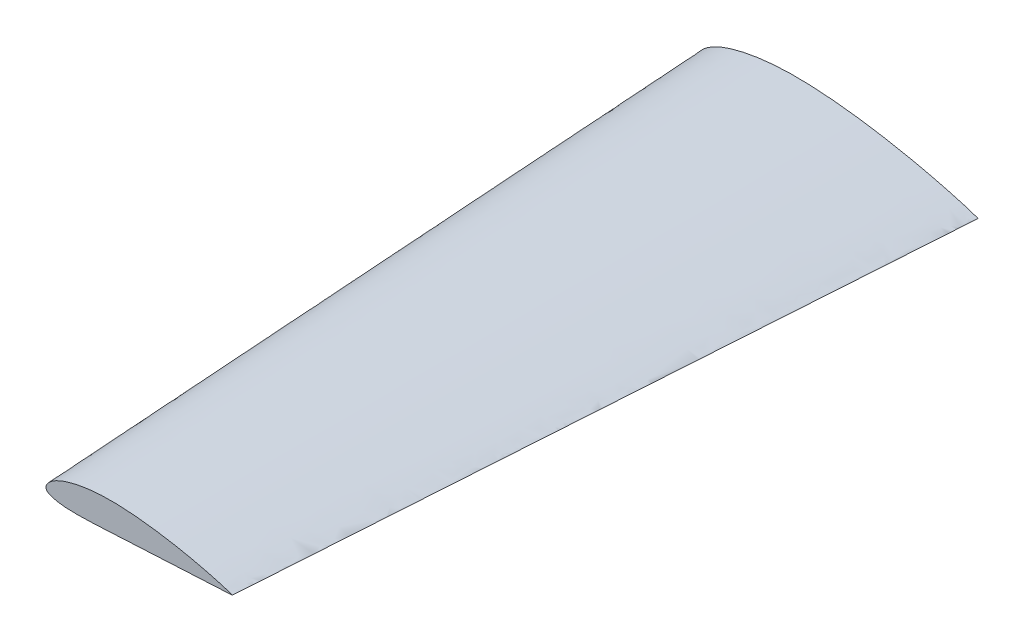
ISO-10303-21;
HEADER;
FILE_DESCRIPTION(('STEP AP214'),'2;1');
FILE_NAME('part.step','',(''),(''),'','','');
FILE_SCHEMA(('AUTOMOTIVE_DESIGN { 1 0 10303 214 1 1 1 1 }'));
ENDSEC;
DATA;
#1=APPLICATION_CONTEXT('core data for automotive mechanical design processes');
#2=APPLICATION_PROTOCOL_DEFINITION('international standard','automotive_design',2000,#1);
#3=PRODUCT_CONTEXT('',#1,'mechanical');
#4=PRODUCT('Part','Part','',(#3));
#5=PRODUCT_RELATED_PRODUCT_CATEGORY('part','',(#4));
#6=PRODUCT_DEFINITION_FORMATION('','',#4);
#7=PRODUCT_DEFINITION_CONTEXT('part definition',#1,'design');
#8=PRODUCT_DEFINITION('design','',#6,#7);
#9=PRODUCT_DEFINITION_SHAPE('','',#8);
#10=(LENGTH_UNIT() NAMED_UNIT(*) SI_UNIT(.MILLI.,.METRE.));
#11=(NAMED_UNIT(*) PLANE_ANGLE_UNIT() SI_UNIT($,.RADIAN.));
#12=(NAMED_UNIT(*) SI_UNIT($,.STERADIAN.) SOLID_ANGLE_UNIT());
#13=UNCERTAINTY_MEASURE_WITH_UNIT(LENGTH_MEASURE(1.E-05),#10,'distance_accuracy_value','');
#14=(GEOMETRIC_REPRESENTATION_CONTEXT(3) GLOBAL_UNCERTAINTY_ASSIGNED_CONTEXT((#13)) GLOBAL_UNIT_ASSIGNED_CONTEXT((#10,
#11,#12)) REPRESENTATION_CONTEXT('',''));
#15=CARTESIAN_POINT('',(0.,0.,0.));
#16=DIRECTION('',(0.,0.,1.));
#17=DIRECTION('',(1.,0.,0.));
#18=AXIS2_PLACEMENT_3D('',#15,#16,#17);
#19=CARTESIAN_POINT('',(20.3542982458675,1.34514342964588,300.));
#20=DIRECTION('',(0.,0.,-1.));
#21=DIRECTION('',(-1.,0.,0.));
#22=AXIS2_PLACEMENT_3D('',#19,#20,#21);
#23=PLANE('',#22);
#24=CARTESIAN_POINT('',(100.,0.,300.));
#25=CARTESIAN_POINT('',(100.014923169262,0.0592388089626518,300.));
#26=CARTESIAN_POINT('',(98.3529769440514,0.511038186945055,300.));
#27=CARTESIAN_POINT('',(97.0969794574008,1.03966162187566,300.));
#28=CARTESIAN_POINT('',(94.4018178812771,1.80139976342404,300.));
#29=CARTESIAN_POINT('',(91.5774953760021,2.59080174867619,300.));
#30=CARTESIAN_POINT('',(88.1259798370144,3.47753080508084,300.));
#31=CARTESIAN_POINT('',(84.2217100096211,4.40446850526963,300.));
#32=CARTESIAN_POINT('',(79.8953408602356,5.35215076036016,300.));
#33=CARTESIAN_POINT('',(75.2308646597816,6.2701026833677,300.));
#34=CARTESIAN_POINT('',(70.3041328387238,7.11696708440821,300.));
#35=CARTESIAN_POINT('',(65.2008228846164,7.85540207923427,300.));
#36=CARTESIAN_POINT('',(60.0084258675896,8.45749052318448,300.));
#37=CARTESIAN_POINT('',(54.8154414029379,8.89296179445461,300.));
#38=CARTESIAN_POINT('',(49.7087787786779,9.11718139088869,300.));
#39=CARTESIAN_POINT('',(44.7749515151268,9.08549151114679,300.));
#40=CARTESIAN_POINT('',(40.1001215647839,8.78047675865518,300.));
#41=CARTESIAN_POINT('',(35.7650377112056,8.22003855734951,300.));
#42=CARTESIAN_POINT('',(31.8431393592005,7.43515761318965,300.));
#43=CARTESIAN_POINT('',(28.3975621307644,6.47381434625063,300.));
#44=CARTESIAN_POINT('',(25.4743709849585,5.36057571079238,300.));
#45=CARTESIAN_POINT('',(23.1643125092464,4.08874700360212,300.));
#46=CARTESIAN_POINT('',(21.4182453437574,2.80505456301613,300.));
#47=CARTESIAN_POINT('',(20.3342940907016,1.4857636098498,300.));
#48=CARTESIAN_POINT('',(19.848876137766,0.16094790784733,300.));
#49=CARTESIAN_POINT('',(20.5607003857686,-1.62078308380909,300.));
#50=CARTESIAN_POINT('',(23.3461486495499,-2.47062334575145,300.));
#51=CARTESIAN_POINT('',(27.0944757373181,-3.21353066773721,300.));
#52=CARTESIAN_POINT('',(32.0919146293912,-3.38211658366619,300.));
#53=CARTESIAN_POINT('',(38.0597809883925,-3.29061362877646,300.));
#54=CARTESIAN_POINT('',(44.8910379391885,-2.95007097060458,300.));
#55=CARTESIAN_POINT('',(52.2961856480144,-2.58123272556939,300.));
#56=CARTESIAN_POINT('',(60.0015784426429,-2.17844007735752,300.));
#57=CARTESIAN_POINT('',(67.7029961352897,-1.72772962023577,300.));
#58=CARTESIAN_POINT('',(75.1137779773506,-1.27940221867296,300.));
#59=CARTESIAN_POINT('',(81.9255850266116,-0.915018444337756,300.));
#60=CARTESIAN_POINT('',(87.9561922617108,-0.63965732422303,300.));
#61=CARTESIAN_POINT('',(92.7389461096696,-0.400523517451224,300.));
#62=CARTESIAN_POINT('',(96.6958495882715,-0.306482613810462,300.));
#63=CARTESIAN_POINT('',(98.3883941773635,-0.0811743747246907,300.));
#64=CARTESIAN_POINT('',(99.9859090432853,-0.0559352693961097,300.));
#65=CARTESIAN_POINT('',(100.,0.,300.));
#66=B_SPLINE_CURVE_WITH_KNOTS('',3,(#24,#25,#26,#27,#28,#29,#30,#31,#32,#33,#34,#35,#36,#37,#38,
#39,#40,#41,#42,#43,#44,#45,#46,#47,#48,#49,#50,#51,#52,#53,#54,#55,#56,#57,#58,#59,#60,#61,#62,
#63,#64,#65),.UNSPECIFIED.,.T.,.F.,(4,1,1,1,1,1,1,1,1,1,1,1,1,1,1,1,1,1,1,1,1,1,1,1,1,1,1,1,1,1,
1,1,1,1,1,1,1,1,1,4),(0.,0.00495576371400358,0.0195005280764471,0.0341339283486635,
0.0524049542143257,0.0739943309224443,0.0984931531585991,0.125474601337429,0.154451971064024,
0.184909300231469,0.216326676925909,0.248168985989691,0.279908729565615,0.311030457196045,
0.341049811862573,0.369546227571225,0.396130574732561,0.420447044709539,0.442179640217013,
0.461102572305862,0.477136471921637,0.490041484410884,0.500147947583578,0.508077763123304,
0.514148335024584,0.53273119249296,0.555552546441872,0.58573949839938,0.622463906786317,
0.664407467873401,0.709926080574513,0.757276032828189,0.804638844685232,0.850179122578555,
0.892141924950279,0.928905522286394,0.959074072533095,0.981494735532468,0.995320601759886,1.),.UNSPECIFIED.);
#67=CARTESIAN_POINT('',(100.,0.,300.));
#68=VERTEX_POINT('',#67);
#69=EDGE_CURVE('E11',#68,#68,#66,.T.);
#70=ORIENTED_EDGE('',*,*,#69,.T.);
#71=EDGE_LOOP('',(#70));
#72=FACE_BOUND('',#71,.T.);
#73=ADVANCED_FACE('F49',(#72),#23,.F.);
#74=CARTESIAN_POINT('',(0.53144736880117,2.01771514446881,0.));
#75=DIRECTION('',(0.,0.,-1.));
#76=DIRECTION('',(-1.,0.,0.));
#77=AXIS2_PLACEMENT_3D('',#74,#75,#76);
#78=PLANE('',#77);
#79=CARTESIAN_POINT('',(120.,0.,0.));
#80=CARTESIAN_POINT('',(120.022384753893,0.0888582134439777,0.));
#81=CARTESIAN_POINT('',(117.529465416077,0.766557280417583,0.));
#82=CARTESIAN_POINT('',(115.645469186101,1.5594924328135,0.));
#83=CARTESIAN_POINT('',(111.602726821916,2.70209964513606,0.));
#84=CARTESIAN_POINT('',(107.366243064003,3.88620262301428,0.));
#85=CARTESIAN_POINT('',(102.188969755522,5.21629620762126,0.));
#86=CARTESIAN_POINT('',(96.3325650144317,6.60670275790445,0.));
#87=CARTESIAN_POINT('',(89.8430112903535,8.02822614054024,0.));
#88=CARTESIAN_POINT('',(82.8462969896723,9.40515402505156,0.));
#89=CARTESIAN_POINT('',(75.4561992580857,10.6754506266123,0.));
#90=CARTESIAN_POINT('',(67.8012343269246,11.7831031188514,0.));
#91=CARTESIAN_POINT('',(60.0126388013843,12.6862357847767,0.));
#92=CARTESIAN_POINT('',(52.2231621044069,13.3394426916819,0.));
#93=CARTESIAN_POINT('',(44.5631681680168,13.675772086333,0.));
#94=CARTESIAN_POINT('',(37.1624272726901,13.6282372667202,0.));
#95=CARTESIAN_POINT('',(30.1501823471758,13.1707151379828,0.));
#96=CARTESIAN_POINT('',(23.6475565668083,12.3300578360243,0.));
#97=CARTESIAN_POINT('',(17.7647090388008,11.1527364197845,0.));
#98=CARTESIAN_POINT('',(12.5963431961465,9.71072151937595,0.));
#99=CARTESIAN_POINT('',(8.21155647743776,8.04086356618857,0.));
#100=CARTESIAN_POINT('',(4.74646876386956,6.13312050540317,0.));
#101=CARTESIAN_POINT('',(2.12736801563615,4.2075818445242,0.));
#102=CARTESIAN_POINT('',(0.501441136052392,2.2286454147747,0.));
#103=CARTESIAN_POINT('',(-0.226685793350984,0.241421861770996,0.));
#104=CARTESIAN_POINT('',(0.841050578652947,-2.43117462571363,0.));
#105=CARTESIAN_POINT('',(5.01922297432486,-3.70593501862717,0.));
#106=CARTESIAN_POINT('',(10.6417136059772,-4.82029600160582,0.));
#107=CARTESIAN_POINT('',(18.1378719440869,-5.07317487549928,0.));
#108=CARTESIAN_POINT('',(27.0896714825887,-4.93592044316468,0.));
#109=CARTESIAN_POINT('',(37.3365569087827,-4.42510645590687,0.));
#110=CARTESIAN_POINT('',(48.4442784720216,-3.87184908835409,0.));
#111=CARTESIAN_POINT('',(60.0023676639643,-3.26766011603629,0.));
#112=CARTESIAN_POINT('',(71.5544942029345,-2.59159443035365,0.));
#113=CARTESIAN_POINT('',(82.6706669660259,-1.91910332800944,0.));
#114=CARTESIAN_POINT('',(92.8883775399175,-1.37252766650663,0.));
#115=CARTESIAN_POINT('',(101.934288392566,-0.959485986334544,0.));
#116=CARTESIAN_POINT('',(109.108419164504,-0.600785276176836,0.));
#117=CARTESIAN_POINT('',(115.043774382407,-0.459723920715693,0.));
#118=CARTESIAN_POINT('',(117.582591266045,-0.121761562087036,0.));
#119=CARTESIAN_POINT('',(119.978863564928,-0.0839029040941646,0.));
#120=CARTESIAN_POINT('',(120.,0.,0.));
#121=B_SPLINE_CURVE_WITH_KNOTS('',3,(#79,#80,#81,#82,#83,#84,#85,#86,#87,#88,#89,#90,#91,#92,
#93,#94,#95,#96,#97,#98,#99,#100,#101,#102,#103,#104,#105,#106,#107,#108,#109,#110,#111,#112,
#113,#114,#115,#116,#117,#118,#119,#120),.UNSPECIFIED.,.T.,.F.,(4,1,1,1,1,1,1,1,1,1,1,1,1,1,1,1,
1,1,1,1,1,1,1,1,1,1,1,1,1,1,1,1,1,1,1,1,1,1,1,4),(0.,0.00495576371400358,0.0195005280764471,
0.0341339283486635,0.0524049542143257,0.0739943309224443,0.0984931531585991,0.125474601337429,
0.154451971064024,0.184909300231469,0.216326676925909,0.248168985989691,0.279908729565615,
0.311030457196045,0.341049811862573,0.369546227571225,0.396130574732561,0.420447044709539,
0.442179640217013,0.461102572305862,0.477136471921637,0.490041484410884,0.500147947583578,
0.508077763123304,0.514148335024584,0.53273119249296,0.555552546441872,0.58573949839938,
0.622463906786317,0.664407467873401,0.709926080574513,0.757276032828189,0.804638844685232,
0.850179122578555,0.892141924950279,0.928905522286394,0.959074072533095,0.981494735532468,
0.995320601759886,1.),.UNSPECIFIED.);
#122=CARTESIAN_POINT('',(120.,0.,0.));
#123=VERTEX_POINT('',#122);
#124=EDGE_CURVE('E59',#123,#123,#121,.T.);
#125=ORIENTED_EDGE('',*,*,#124,.F.);
#126=EDGE_LOOP('',(#125));
#127=FACE_BOUND('',#126,.T.);
#128=ADVANCED_FACE('F87',(#127),#78,.T.);
#129=CARTESIAN_POINT('',(120.,0.,0.));
#130=CARTESIAN_POINT('',(100.,0.,300.));
#131=CARTESIAN_POINT('',(120.022384753893,0.0888582134439777,0.));
#132=CARTESIAN_POINT('',(100.014923169262,0.0592388089626518,300.));
#133=CARTESIAN_POINT('',(117.529465416077,0.766557280417583,0.));
#134=CARTESIAN_POINT('',(98.3529769440514,0.511038186945055,300.));
#135=CARTESIAN_POINT('',(115.645469186101,1.5594924328135,0.));
#136=CARTESIAN_POINT('',(97.0969794574008,1.03966162187566,300.));
#137=CARTESIAN_POINT('',(111.602726821916,2.70209964513606,0.));
#138=CARTESIAN_POINT('',(94.4018178812771,1.80139976342404,300.));
#139=CARTESIAN_POINT('',(107.366243064003,3.88620262301428,0.));
#140=CARTESIAN_POINT('',(91.5774953760021,2.59080174867619,300.));
#141=CARTESIAN_POINT('',(102.188969755522,5.21629620762126,0.));
#142=CARTESIAN_POINT('',(88.1259798370144,3.47753080508084,300.));
#143=CARTESIAN_POINT('',(96.3325650144317,6.60670275790445,0.));
#144=CARTESIAN_POINT('',(84.2217100096211,4.40446850526963,300.));
#145=CARTESIAN_POINT('',(89.8430112903535,8.02822614054024,0.));
#146=CARTESIAN_POINT('',(79.8953408602356,5.35215076036016,300.));
#147=CARTESIAN_POINT('',(82.8462969896723,9.40515402505156,0.));
#148=CARTESIAN_POINT('',(75.2308646597816,6.2701026833677,300.));
#149=CARTESIAN_POINT('',(75.4561992580857,10.6754506266123,0.));
#150=CARTESIAN_POINT('',(70.3041328387238,7.11696708440821,300.));
#151=CARTESIAN_POINT('',(67.8012343269246,11.7831031188514,0.));
#152=CARTESIAN_POINT('',(65.2008228846164,7.85540207923427,300.));
#153=CARTESIAN_POINT('',(60.0126388013843,12.6862357847767,0.));
#154=CARTESIAN_POINT('',(60.0084258675896,8.45749052318448,300.));
#155=CARTESIAN_POINT('',(52.2231621044069,13.3394426916819,0.));
#156=CARTESIAN_POINT('',(54.8154414029379,8.89296179445461,300.));
#157=CARTESIAN_POINT('',(44.5631681680168,13.675772086333,0.));
#158=CARTESIAN_POINT('',(49.7087787786779,9.11718139088869,300.));
#159=CARTESIAN_POINT('',(37.1624272726901,13.6282372667202,0.));
#160=CARTESIAN_POINT('',(44.7749515151268,9.08549151114679,300.));
#161=CARTESIAN_POINT('',(30.1501823471758,13.1707151379828,0.));
#162=CARTESIAN_POINT('',(40.1001215647839,8.78047675865518,300.));
#163=CARTESIAN_POINT('',(23.6475565668083,12.3300578360243,0.));
#164=CARTESIAN_POINT('',(35.7650377112056,8.22003855734951,300.));
#165=CARTESIAN_POINT('',(17.7647090388008,11.1527364197845,0.));
#166=CARTESIAN_POINT('',(31.8431393592005,7.43515761318965,300.));
#167=CARTESIAN_POINT('',(12.5963431961465,9.71072151937595,0.));
#168=CARTESIAN_POINT('',(28.3975621307644,6.47381434625063,300.));
#169=CARTESIAN_POINT('',(8.21155647743776,8.04086356618857,0.));
#170=CARTESIAN_POINT('',(25.4743709849585,5.36057571079238,300.));
#171=CARTESIAN_POINT('',(4.74646876386956,6.13312050540317,0.));
#172=CARTESIAN_POINT('',(23.1643125092464,4.08874700360212,300.));
#173=CARTESIAN_POINT('',(2.12736801563615,4.2075818445242,0.));
#174=CARTESIAN_POINT('',(21.4182453437574,2.80505456301613,300.));
#175=CARTESIAN_POINT('',(0.501441136052392,2.2286454147747,0.));
#176=CARTESIAN_POINT('',(20.3342940907016,1.4857636098498,300.));
#177=CARTESIAN_POINT('',(-0.226685793350984,0.241421861770996,0.));
#178=CARTESIAN_POINT('',(19.848876137766,0.16094790784733,300.));
#179=CARTESIAN_POINT('',(0.841050578652947,-2.43117462571363,0.));
#180=CARTESIAN_POINT('',(20.5607003857686,-1.62078308380909,300.));
#181=CARTESIAN_POINT('',(5.01922297432486,-3.70593501862717,0.));
#182=CARTESIAN_POINT('',(23.3461486495499,-2.47062334575145,300.));
#183=CARTESIAN_POINT('',(10.6417136059772,-4.82029600160582,0.));
#184=CARTESIAN_POINT('',(27.0944757373181,-3.21353066773721,300.));
#185=CARTESIAN_POINT('',(18.1378719440869,-5.07317487549928,0.));
#186=CARTESIAN_POINT('',(32.0919146293912,-3.38211658366619,300.));
#187=CARTESIAN_POINT('',(27.0896714825887,-4.93592044316468,0.));
#188=CARTESIAN_POINT('',(38.0597809883925,-3.29061362877646,300.));
#189=CARTESIAN_POINT('',(37.3365569087827,-4.42510645590687,0.));
#190=CARTESIAN_POINT('',(44.8910379391885,-2.95007097060458,300.));
#191=CARTESIAN_POINT('',(48.4442784720216,-3.87184908835409,0.));
#192=CARTESIAN_POINT('',(52.2961856480144,-2.58123272556939,300.));
#193=CARTESIAN_POINT('',(60.0023676639643,-3.26766011603629,0.));
#194=CARTESIAN_POINT('',(60.0015784426429,-2.17844007735752,300.));
#195=CARTESIAN_POINT('',(71.5544942029345,-2.59159443035365,0.));
#196=CARTESIAN_POINT('',(67.7029961352897,-1.72772962023577,300.));
#197=CARTESIAN_POINT('',(82.6706669660259,-1.91910332800944,0.));
#198=CARTESIAN_POINT('',(75.1137779773506,-1.27940221867296,300.));
#199=CARTESIAN_POINT('',(92.8883775399175,-1.37252766650663,0.));
#200=CARTESIAN_POINT('',(81.9255850266116,-0.915018444337756,300.));
#201=CARTESIAN_POINT('',(101.934288392566,-0.959485986334544,0.));
#202=CARTESIAN_POINT('',(87.9561922617108,-0.63965732422303,300.));
#203=CARTESIAN_POINT('',(109.108419164504,-0.600785276176836,0.));
#204=CARTESIAN_POINT('',(92.7389461096696,-0.400523517451224,300.));
#205=CARTESIAN_POINT('',(115.043774382407,-0.459723920715693,0.));
#206=CARTESIAN_POINT('',(96.6958495882715,-0.306482613810462,300.));
#207=CARTESIAN_POINT('',(117.582591266045,-0.121761562087036,0.));
#208=CARTESIAN_POINT('',(98.3883941773635,-0.0811743747246907,300.));
#209=CARTESIAN_POINT('',(119.978863564928,-0.0839029040941646,0.));
#210=CARTESIAN_POINT('',(99.9859090432853,-0.0559352693961097,300.));
#211=CARTESIAN_POINT('',(120.,0.,0.));
#212=CARTESIAN_POINT('',(100.,0.,300.));
#213=B_SPLINE_SURFACE_WITH_KNOTS('',3,1,((#129,#130),(#131,#132),(#133,#134),(#135,#136),(#137,
#138),(#139,#140),(#141,#142),(#143,#144),(#145,#146),(#147,#148),(#149,#150),(#151,#152),(#153,
#154),(#155,#156),(#157,#158),(#159,#160),(#161,#162),(#163,#164),(#165,#166),(#167,#168),(#169,
#170),(#171,#172),(#173,#174),(#175,#176),(#177,#178),(#179,#180),(#181,#182),(#183,#184),(#185,
#186),(#187,#188),(#189,#190),(#191,#192),(#193,#194),(#195,#196),(#197,#198),(#199,#200),(#201,
#202),(#203,#204),(#205,#206),(#207,#208),(#209,#210),(#211,#212)),.UNSPECIFIED.,.T.,.F.,.F.,(4,
1,1,1,1,1,1,1,1,1,1,1,1,1,1,1,1,1,1,1,1,1,1,1,1,1,1,1,1,1,1,1,1,1,1,1,1,1,1,4),(2,2),(0.,
0.00495576371400358,0.0195005280764471,0.0341339283486635,0.0524049542143257,0.0739943309224443,
0.0984931531585991,0.125474601337429,0.154451971064024,0.184909300231469,0.216326676925909,
0.248168985989691,0.279908729565615,0.311030457196045,0.341049811862573,0.369546227571225,
0.396130574732561,0.420447044709539,0.442179640217013,0.461102572305862,0.477136471921637,
0.490041484410884,0.500147947583578,0.508077763123304,0.514148335024584,0.53273119249296,
0.555552546441872,0.58573949839938,0.622463906786317,0.664407467873401,0.709926080574513,
0.757276032828189,0.804638844685232,0.850179122578555,0.892141924950279,0.928905522286394,
0.959074072533095,0.981494735532468,0.995320601759886,1.),(0.,1.),.UNSPECIFIED.);
#214=ORIENTED_EDGE('',*,*,#124,.T.);
#215=EDGE_LOOP('',(#214));
#216=FACE_BOUND('',#215,.T.);
#217=ORIENTED_EDGE('',*,*,#69,.F.);
#218=EDGE_LOOP('',(#217));
#219=FACE_BOUND('',#218,.T.);
#220=ADVANCED_FACE('F95',(#216,#219),#213,.T.);
#221=CLOSED_SHELL('',(#73,#128,#220));
#222=MANIFOLD_SOLID_BREP('B2',#221);
#223=ADVANCED_BREP_SHAPE_REPRESENTATION('',(#18,#222),#14);
#224=SHAPE_DEFINITION_REPRESENTATION(#9,#223);
ENDSEC;
END-ISO-10303-21;
